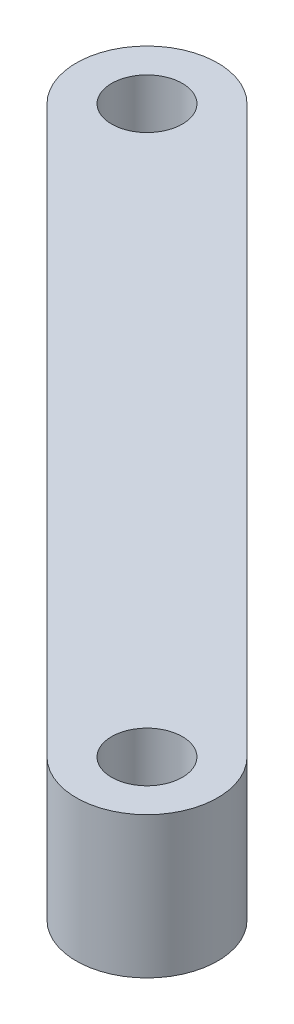
ISO-10303-21;
HEADER;
FILE_DESCRIPTION(('STEP AP214'),'2;1');
FILE_NAME('part.step','',(''),(''),'','','');
FILE_SCHEMA(('AUTOMOTIVE_DESIGN { 1 0 10303 214 1 1 1 1 }'));
ENDSEC;
DATA;
#1=APPLICATION_CONTEXT('core data for automotive mechanical design processes');
#2=APPLICATION_PROTOCOL_DEFINITION('international standard','automotive_design',2000,#1);
#3=PRODUCT_CONTEXT('',#1,'mechanical');
#4=PRODUCT('Part','Part','',(#3));
#5=PRODUCT_RELATED_PRODUCT_CATEGORY('part','',(#4));
#6=PRODUCT_DEFINITION_FORMATION('','',#4);
#7=PRODUCT_DEFINITION_CONTEXT('part definition',#1,'design');
#8=PRODUCT_DEFINITION('design','',#6,#7);
#9=PRODUCT_DEFINITION_SHAPE('','',#8);
#10=(LENGTH_UNIT() NAMED_UNIT(*) SI_UNIT(.MILLI.,.METRE.));
#11=(NAMED_UNIT(*) PLANE_ANGLE_UNIT() SI_UNIT($,.RADIAN.));
#12=(NAMED_UNIT(*) SI_UNIT($,.STERADIAN.) SOLID_ANGLE_UNIT());
#13=UNCERTAINTY_MEASURE_WITH_UNIT(LENGTH_MEASURE(1.E-05),#10,'distance_accuracy_value','');
#14=(GEOMETRIC_REPRESENTATION_CONTEXT(3) GLOBAL_UNCERTAINTY_ASSIGNED_CONTEXT((#13)) GLOBAL_UNIT_ASSIGNED_CONTEXT((#10,
#11,#12)) REPRESENTATION_CONTEXT('',''));
#15=CARTESIAN_POINT('',(0.,0.,0.));
#16=DIRECTION('',(0.,0.,1.));
#17=DIRECTION('',(1.,0.,0.));
#18=AXIS2_PLACEMENT_3D('',#15,#16,#17);
#19=CARTESIAN_POINT('',(-10.,5.,-10.));
#20=DIRECTION('',(0.,-1.,0.));
#21=DIRECTION('',(0.,0.,-1.));
#22=AXIS2_PLACEMENT_3D('',#19,#20,#21);
#23=CYLINDRICAL_SURFACE('',#22,2.5);
#24=CARTESIAN_POINT('',(-10.,0.,-10.));
#25=DIRECTION('',(0.,1.,0.));
#26=DIRECTION('',(0.,0.,-1.));
#27=AXIS2_PLACEMENT_3D('',#24,#25,#26);
#28=CIRCLE('',#27,2.5);
#29=CARTESIAN_POINT('',(-8.23223304703364,0.,-11.7677669529664));
#30=VERTEX_POINT('',#29);
#31=CARTESIAN_POINT('',(-11.7677669529664,0.,-8.23223304703363));
#32=VERTEX_POINT('',#31);
#33=EDGE_CURVE('E96',#30,#32,#28,.T.);
#34=ORIENTED_EDGE('',*,*,#33,.T.);
#35=DIRECTION('',(0.,-1.,0.));
#36=VECTOR('',#35,1.);
#37=CARTESIAN_POINT('',(-11.7677669529664,5.,-8.23223304703363));
#38=LINE('',#37,#36);
#39=CARTESIAN_POINT('',(-11.7677669529664,5.,-8.23223304703363));
#40=VERTEX_POINT('',#39);
#41=EDGE_CURVE('E11',#40,#32,#38,.T.);
#42=ORIENTED_EDGE('',*,*,#41,.F.);
#43=CARTESIAN_POINT('',(-10.,5.,-10.));
#44=DIRECTION('',(0.,1.,0.));
#45=DIRECTION('',(0.,0.,-1.));
#46=AXIS2_PLACEMENT_3D('',#43,#44,#45);
#47=CIRCLE('',#46,2.5);
#48=CARTESIAN_POINT('',(-8.23223304703364,5.,-11.7677669529664));
#49=VERTEX_POINT('',#48);
#50=EDGE_CURVE('E84',#49,#40,#47,.T.);
#51=ORIENTED_EDGE('',*,*,#50,.F.);
#52=DIRECTION('',(0.,-1.,0.));
#53=VECTOR('',#52,1.);
#54=CARTESIAN_POINT('',(-8.23223304703364,5.,-11.7677669529664));
#55=LINE('',#54,#53);
#56=EDGE_CURVE('E92',#49,#30,#55,.T.);
#57=ORIENTED_EDGE('',*,*,#56,.T.);
#58=EDGE_LOOP('',(#34,#42,#51,#57));
#59=FACE_BOUND('',#58,.T.);
#60=ADVANCED_FACE('F33',(#59),#23,.T.);
#61=CARTESIAN_POINT('',(-11.7677669529664,5.,-8.23223304703363));
#62=DIRECTION('',(0.707106781186547,0.,-0.707106781186548));
#63=DIRECTION('',(-0.707106781186548,0.,-0.707106781186547));
#64=AXIS2_PLACEMENT_3D('',#61,#62,#63);
#65=PLANE('',#64);
#66=DIRECTION('',(0.707106781186548,0.,0.707106781186547));
#67=VECTOR('',#66,1.);
#68=CARTESIAN_POINT('',(-11.7677669529664,0.,-8.23223304703363));
#69=LINE('',#68,#67);
#70=CARTESIAN_POINT('',(8.23223304703363,0.,11.7677669529664));
#71=VERTEX_POINT('',#70);
#72=EDGE_CURVE('E88',#32,#71,#69,.T.);
#73=ORIENTED_EDGE('',*,*,#72,.T.);
#74=DIRECTION('',(0.,-1.,0.));
#75=VECTOR('',#74,1.);
#76=CARTESIAN_POINT('',(8.23223304703363,5.,11.7677669529664));
#77=LINE('',#76,#75);
#78=CARTESIAN_POINT('',(8.23223304703363,5.,11.7677669529664));
#79=VERTEX_POINT('',#78);
#80=EDGE_CURVE('E41',#79,#71,#77,.T.);
#81=ORIENTED_EDGE('',*,*,#80,.F.);
#82=DIRECTION('',(0.707106781186548,0.,0.707106781186547));
#83=VECTOR('',#82,1.);
#84=CARTESIAN_POINT('',(-11.7677669529664,5.,-8.23223304703363));
#85=LINE('',#84,#83);
#86=EDGE_CURVE('E79',#40,#79,#85,.T.);
#87=ORIENTED_EDGE('',*,*,#86,.F.);
#88=ORIENTED_EDGE('',*,*,#41,.T.);
#89=EDGE_LOOP('',(#73,#81,#87,#88));
#90=FACE_BOUND('',#89,.T.);
#91=ADVANCED_FACE('F87',(#90),#65,.F.);
#92=CARTESIAN_POINT('',(10.,5.,10.));
#93=DIRECTION('',(0.,-1.,0.));
#94=DIRECTION('',(0.,0.,-1.));
#95=AXIS2_PLACEMENT_3D('',#92,#93,#94);
#96=CYLINDRICAL_SURFACE('',#95,2.5);
#97=CARTESIAN_POINT('',(10.,0.,10.));
#98=DIRECTION('',(0.,1.,0.));
#99=DIRECTION('',(0.,0.,-1.));
#100=AXIS2_PLACEMENT_3D('',#97,#98,#99);
#101=CIRCLE('',#100,2.5);
#102=CARTESIAN_POINT('',(11.7677669529664,0.,8.23223304703363));
#103=VERTEX_POINT('',#102);
#104=EDGE_CURVE('E66',#71,#103,#101,.T.);
#105=ORIENTED_EDGE('',*,*,#104,.T.);
#106=DIRECTION('',(0.,-1.,0.));
#107=VECTOR('',#106,1.);
#108=CARTESIAN_POINT('',(11.7677669529664,5.,8.23223304703363));
#109=LINE('',#108,#107);
#110=CARTESIAN_POINT('',(11.7677669529664,5.,8.23223304703363));
#111=VERTEX_POINT('',#110);
#112=EDGE_CURVE('E89',#111,#103,#109,.T.);
#113=ORIENTED_EDGE('',*,*,#112,.F.);
#114=CARTESIAN_POINT('',(10.,5.,10.));
#115=DIRECTION('',(0.,1.,0.));
#116=DIRECTION('',(0.,0.,-1.));
#117=AXIS2_PLACEMENT_3D('',#114,#115,#116);
#118=CIRCLE('',#117,2.5);
#119=EDGE_CURVE('E82',#79,#111,#118,.T.);
#120=ORIENTED_EDGE('',*,*,#119,.F.);
#121=ORIENTED_EDGE('',*,*,#80,.T.);
#122=EDGE_LOOP('',(#105,#113,#120,#121));
#123=FACE_BOUND('',#122,.T.);
#124=ADVANCED_FACE('F90',(#123),#96,.T.);
#125=CARTESIAN_POINT('',(11.7677669529664,5.,8.23223304703363));
#126=DIRECTION('',(-0.707106781186547,0.,0.707106781186548));
#127=DIRECTION('',(0.707106781186548,0.,0.707106781186547));
#128=AXIS2_PLACEMENT_3D('',#125,#126,#127);
#129=PLANE('',#128);
#130=DIRECTION('',(-0.707106781186548,0.,-0.707106781186547));
#131=VECTOR('',#130,1.);
#132=CARTESIAN_POINT('',(11.7677669529664,0.,8.23223304703363));
#133=LINE('',#132,#131);
#134=EDGE_CURVE('E72',#103,#30,#133,.T.);
#135=ORIENTED_EDGE('',*,*,#134,.T.);
#136=ORIENTED_EDGE('',*,*,#56,.F.);
#137=DIRECTION('',(-0.707106781186548,0.,-0.707106781186547));
#138=VECTOR('',#137,1.);
#139=CARTESIAN_POINT('',(11.7677669529664,5.,8.23223304703363));
#140=LINE('',#139,#138);
#141=EDGE_CURVE('E49',#111,#49,#140,.T.);
#142=ORIENTED_EDGE('',*,*,#141,.F.);
#143=ORIENTED_EDGE('',*,*,#112,.T.);
#144=EDGE_LOOP('',(#135,#136,#142,#143));
#145=FACE_BOUND('',#144,.T.);
#146=ADVANCED_FACE('F104',(#145),#129,.F.);
#147=CARTESIAN_POINT('',(-10.,5.,-10.));
#148=DIRECTION('',(0.,-1.,0.));
#149=DIRECTION('',(0.,0.,-1.));
#150=AXIS2_PLACEMENT_3D('',#147,#148,#149);
#151=PLANE('',#150);
#152=CARTESIAN_POINT('',(-10.,5.,-10.));
#153=DIRECTION('',(0.,1.,0.));
#154=DIRECTION('',(0.,0.,1.));
#155=AXIS2_PLACEMENT_3D('',#152,#153,#154);
#156=CIRCLE('',#155,1.25);
#157=CARTESIAN_POINT('',(-10.,5.,-8.75));
#158=VERTEX_POINT('',#157);
#159=EDGE_CURVE('E116',#158,#158,#156,.T.);
#160=ORIENTED_EDGE('',*,*,#159,.F.);
#161=EDGE_LOOP('',(#160));
#162=FACE_BOUND('',#161,.T.);
#163=CARTESIAN_POINT('',(10.,5.,10.));
#164=DIRECTION('',(0.,1.,0.));
#165=DIRECTION('',(0.,0.,1.));
#166=AXIS2_PLACEMENT_3D('',#163,#164,#165);
#167=CIRCLE('',#166,1.25);
#168=CARTESIAN_POINT('',(10.,5.,11.25));
#169=VERTEX_POINT('',#168);
#170=EDGE_CURVE('E110',#169,#169,#167,.T.);
#171=ORIENTED_EDGE('',*,*,#170,.F.);
#172=EDGE_LOOP('',(#171));
#173=FACE_BOUND('',#172,.T.);
#174=ORIENTED_EDGE('',*,*,#50,.T.);
#175=ORIENTED_EDGE('',*,*,#86,.T.);
#176=ORIENTED_EDGE('',*,*,#119,.T.);
#177=ORIENTED_EDGE('',*,*,#141,.T.);
#178=EDGE_LOOP('',(#174,#175,#176,#177));
#179=FACE_BOUND('',#178,.T.);
#180=ADVANCED_FACE('F80',(#162,#173,#179),#151,.F.);
#181=CARTESIAN_POINT('',(-10.,0.,-10.));
#182=DIRECTION('',(0.,-1.,0.));
#183=DIRECTION('',(0.,0.,-1.));
#184=AXIS2_PLACEMENT_3D('',#181,#182,#183);
#185=PLANE('',#184);
#186=CARTESIAN_POINT('',(-10.,0.,-10.));
#187=DIRECTION('',(0.,1.,0.));
#188=DIRECTION('',(0.,0.,1.));
#189=AXIS2_PLACEMENT_3D('',#186,#187,#188);
#190=CIRCLE('',#189,1.25);
#191=CARTESIAN_POINT('',(-10.,0.,-8.75));
#192=VERTEX_POINT('',#191);
#193=EDGE_CURVE('E99',#192,#192,#190,.T.);
#194=ORIENTED_EDGE('',*,*,#193,.T.);
#195=EDGE_LOOP('',(#194));
#196=FACE_BOUND('',#195,.T.);
#197=CARTESIAN_POINT('',(10.,0.,10.));
#198=DIRECTION('',(0.,1.,0.));
#199=DIRECTION('',(0.,0.,1.));
#200=AXIS2_PLACEMENT_3D('',#197,#198,#199);
#201=CIRCLE('',#200,1.25);
#202=CARTESIAN_POINT('',(10.,0.,11.25));
#203=VERTEX_POINT('',#202);
#204=EDGE_CURVE('E113',#203,#203,#201,.T.);
#205=ORIENTED_EDGE('',*,*,#204,.T.);
#206=EDGE_LOOP('',(#205));
#207=FACE_BOUND('',#206,.T.);
#208=ORIENTED_EDGE('',*,*,#33,.F.);
#209=ORIENTED_EDGE('',*,*,#134,.F.);
#210=ORIENTED_EDGE('',*,*,#104,.F.);
#211=ORIENTED_EDGE('',*,*,#72,.F.);
#212=EDGE_LOOP('',(#208,#209,#210,#211));
#213=FACE_BOUND('',#212,.T.);
#214=ADVANCED_FACE('F107',(#196,#207,#213),#185,.T.);
#215=CARTESIAN_POINT('',(10.,0.,10.));
#216=DIRECTION('',(0.,1.,0.));
#217=DIRECTION('',(0.,0.,1.));
#218=AXIS2_PLACEMENT_3D('',#215,#216,#217);
#219=CYLINDRICAL_SURFACE('',#218,1.25);
#220=ORIENTED_EDGE('',*,*,#204,.F.);
#221=EDGE_LOOP('',(#220));
#222=FACE_BOUND('',#221,.T.);
#223=ORIENTED_EDGE('',*,*,#170,.T.);
#224=EDGE_LOOP('',(#223));
#225=FACE_BOUND('',#224,.T.);
#226=ADVANCED_FACE('F127',(#222,#225),#219,.F.);
#227=CARTESIAN_POINT('',(-10.,0.,-10.));
#228=DIRECTION('',(0.,1.,0.));
#229=DIRECTION('',(0.,0.,1.));
#230=AXIS2_PLACEMENT_3D('',#227,#228,#229);
#231=CYLINDRICAL_SURFACE('',#230,1.25);
#232=ORIENTED_EDGE('',*,*,#193,.F.);
#233=EDGE_LOOP('',(#232));
#234=FACE_BOUND('',#233,.T.);
#235=ORIENTED_EDGE('',*,*,#159,.T.);
#236=EDGE_LOOP('',(#235));
#237=FACE_BOUND('',#236,.T.);
#238=ADVANCED_FACE('F124',(#234,#237),#231,.F.);
#239=CLOSED_SHELL('',(#60,#91,#124,#146,#180,#214,#226,#238));
#240=MANIFOLD_SOLID_BREP('B2',#239);
#241=ADVANCED_BREP_SHAPE_REPRESENTATION('',(#18,#240),#14);
#242=SHAPE_DEFINITION_REPRESENTATION(#9,#241);
ENDSEC;
END-ISO-10303-21;
